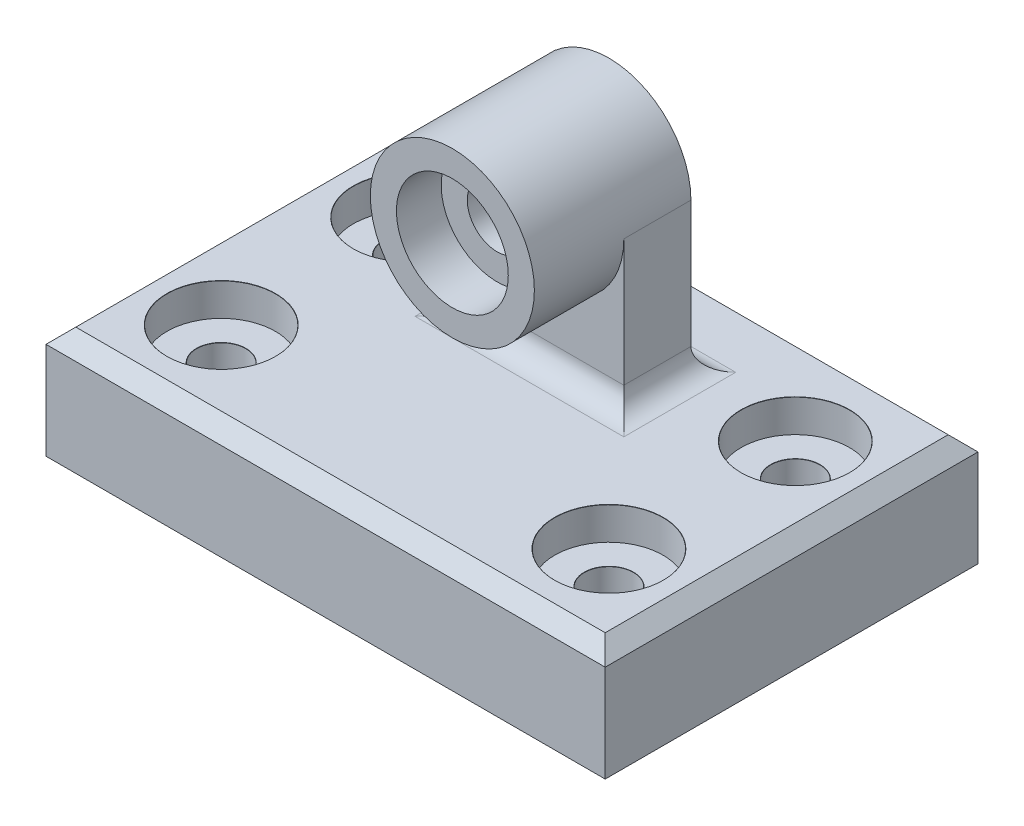
ISO-10303-21;
HEADER;
FILE_DESCRIPTION(('STEP AP214'),'2;1');
FILE_NAME('part.step','',(''),(''),'','','');
FILE_SCHEMA(('AUTOMOTIVE_DESIGN { 1 0 10303 214 1 1 1 1 }'));
ENDSEC;
DATA;
#1=APPLICATION_CONTEXT('core data for automotive mechanical design processes');
#2=APPLICATION_PROTOCOL_DEFINITION('international standard','automotive_design',2000,#1);
#3=PRODUCT_CONTEXT('',#1,'mechanical');
#4=PRODUCT('Part','Part','',(#3));
#5=PRODUCT_RELATED_PRODUCT_CATEGORY('part','',(#4));
#6=PRODUCT_DEFINITION_FORMATION('','',#4);
#7=PRODUCT_DEFINITION_CONTEXT('part definition',#1,'design');
#8=PRODUCT_DEFINITION('design','',#6,#7);
#9=PRODUCT_DEFINITION_SHAPE('','',#8);
#10=(LENGTH_UNIT() NAMED_UNIT(*) SI_UNIT(.MILLI.,.METRE.));
#11=(NAMED_UNIT(*) PLANE_ANGLE_UNIT() SI_UNIT($,.RADIAN.));
#12=(NAMED_UNIT(*) SI_UNIT($,.STERADIAN.) SOLID_ANGLE_UNIT());
#13=UNCERTAINTY_MEASURE_WITH_UNIT(LENGTH_MEASURE(1.E-05),#10,'distance_accuracy_value','');
#14=(GEOMETRIC_REPRESENTATION_CONTEXT(3) GLOBAL_UNCERTAINTY_ASSIGNED_CONTEXT((#13)) GLOBAL_UNIT_ASSIGNED_CONTEXT((#10,
#11,#12)) REPRESENTATION_CONTEXT('',''));
#15=CARTESIAN_POINT('',(0.,0.,0.));
#16=DIRECTION('',(0.,0.,1.));
#17=DIRECTION('',(1.,0.,0.));
#18=AXIS2_PLACEMENT_3D('',#15,#16,#17);
#19=CARTESIAN_POINT('',(37.5,35.,-50.));
#20=DIRECTION('',(0.,0.,1.));
#21=DIRECTION('',(1.,0.,0.));
#22=AXIS2_PLACEMENT_3D('',#19,#20,#21);
#23=CYLINDRICAL_SURFACE('',#22,4.);
#24=CARTESIAN_POINT('',(37.5,35.,-38.));
#25=DIRECTION('',(0.,0.,-1.));
#26=DIRECTION('',(-1.,0.,0.));
#27=AXIS2_PLACEMENT_3D('',#24,#25,#26);
#28=CIRCLE('',#27,4.);
#29=CARTESIAN_POINT('',(33.5,35.,-38.));
#30=VERTEX_POINT('',#29);
#31=EDGE_CURVE('E144',#30,#30,#28,.T.);
#32=ORIENTED_EDGE('',*,*,#31,.T.);
#33=EDGE_LOOP('',(#32));
#34=FACE_BOUND('',#33,.T.);
#35=CARTESIAN_POINT('',(37.5,35.,-23.));
#36=DIRECTION('',(0.,0.,1.));
#37=DIRECTION('',(1.,0.,0.));
#38=AXIS2_PLACEMENT_3D('',#35,#36,#37);
#39=CIRCLE('',#38,4.);
#40=CARTESIAN_POINT('',(41.5,35.,-23.));
#41=VERTEX_POINT('',#40);
#42=EDGE_CURVE('E279',#41,#41,#39,.T.);
#43=ORIENTED_EDGE('',*,*,#42,.T.);
#44=EDGE_LOOP('',(#43));
#45=FACE_BOUND('',#44,.T.);
#46=ADVANCED_FACE('F42',(#34,#45),#23,.F.);
#47=CARTESIAN_POINT('',(0.,15.,-50.));
#48=DIRECTION('',(0.,0.,-1.));
#49=DIRECTION('',(-1.,0.,0.));
#50=AXIS2_PLACEMENT_3D('',#47,#48,#49);
#51=PLANE('',#50);
#52=DIRECTION('',(0.,-1.,0.));
#53=VECTOR('',#52,1.);
#54=CARTESIAN_POINT('',(0.,15.,-50.));
#55=LINE('',#54,#53);
#56=CARTESIAN_POINT('',(0.,13.,-50.));
#57=VERTEX_POINT('',#56);
#58=CARTESIAN_POINT('',(0.,0.,-50.));
#59=VERTEX_POINT('',#58);
#60=EDGE_CURVE('E195',#57,#59,#55,.T.);
#61=ORIENTED_EDGE('',*,*,#60,.F.);
#62=DIRECTION('',(1.,0.,0.));
#63=VECTOR('',#62,1.);
#64=CARTESIAN_POINT('',(0.,13.,-50.));
#65=LINE('',#64,#63);
#66=CARTESIAN_POINT('',(75.,13.,-50.));
#67=VERTEX_POINT('',#66);
#68=EDGE_CURVE('E223',#57,#67,#65,.T.);
#69=ORIENTED_EDGE('',*,*,#68,.T.);
#70=DIRECTION('',(0.,-1.,0.));
#71=VECTOR('',#70,1.);
#72=CARTESIAN_POINT('',(75.,15.,-50.));
#73=LINE('',#72,#71);
#74=CARTESIAN_POINT('',(75.,0.,-50.));
#75=VERTEX_POINT('',#74);
#76=EDGE_CURVE('E194',#67,#75,#73,.T.);
#77=ORIENTED_EDGE('',*,*,#76,.T.);
#78=DIRECTION('',(1.,0.,0.));
#79=VECTOR('',#78,1.);
#80=CARTESIAN_POINT('',(0.,0.,-50.));
#81=LINE('',#80,#79);
#82=EDGE_CURVE('E177',#59,#75,#81,.T.);
#83=ORIENTED_EDGE('',*,*,#82,.F.);
#84=EDGE_LOOP('',(#61,#69,#77,#83));
#85=FACE_BOUND('',#84,.T.);
#86=ADVANCED_FACE('F326',(#85),#51,.T.);
#87=CARTESIAN_POINT('',(0.,15.,0.));
#88=DIRECTION('',(-1.,0.,0.));
#89=DIRECTION('',(0.,0.,1.));
#90=AXIS2_PLACEMENT_3D('',#87,#88,#89);
#91=PLANE('',#90);
#92=DIRECTION('',(0.,-1.,0.));
#93=VECTOR('',#92,1.);
#94=CARTESIAN_POINT('',(0.,15.,0.));
#95=LINE('',#94,#93);
#96=CARTESIAN_POINT('',(0.,13.,0.));
#97=VERTEX_POINT('',#96);
#98=CARTESIAN_POINT('',(0.,0.,0.));
#99=VERTEX_POINT('',#98);
#100=EDGE_CURVE('E199',#97,#99,#95,.T.);
#101=ORIENTED_EDGE('',*,*,#100,.F.);
#102=DIRECTION('',(0.,0.,-1.));
#103=VECTOR('',#102,1.);
#104=CARTESIAN_POINT('',(0.,13.,0.));
#105=LINE('',#104,#103);
#106=EDGE_CURVE('E226',#97,#57,#105,.T.);
#107=ORIENTED_EDGE('',*,*,#106,.T.);
#108=ORIENTED_EDGE('',*,*,#60,.T.);
#109=DIRECTION('',(0.,0.,-1.));
#110=VECTOR('',#109,1.);
#111=CARTESIAN_POINT('',(0.,0.,0.));
#112=LINE('',#111,#110);
#113=EDGE_CURVE('E190',#99,#59,#112,.T.);
#114=ORIENTED_EDGE('',*,*,#113,.F.);
#115=EDGE_LOOP('',(#101,#107,#108,#114));
#116=FACE_BOUND('',#115,.T.);
#117=ADVANCED_FACE('F331',(#116),#91,.T.);
#118=CARTESIAN_POINT('',(0.,15.,0.));
#119=DIRECTION('',(0.,0.,-1.));
#120=DIRECTION('',(-1.,0.,0.));
#121=AXIS2_PLACEMENT_3D('',#118,#119,#120);
#122=PLANE('',#121);
#123=DIRECTION('',(0.,-1.,0.));
#124=VECTOR('',#123,1.);
#125=CARTESIAN_POINT('',(75.,15.,0.));
#126=LINE('',#125,#124);
#127=CARTESIAN_POINT('',(75.,13.,0.));
#128=VERTEX_POINT('',#127);
#129=CARTESIAN_POINT('',(75.,0.,0.));
#130=VERTEX_POINT('',#129);
#131=EDGE_CURVE('E202',#128,#130,#126,.T.);
#132=ORIENTED_EDGE('',*,*,#131,.F.);
#133=DIRECTION('',(-1.,0.,0.));
#134=VECTOR('',#133,1.);
#135=CARTESIAN_POINT('',(0.,13.,0.));
#136=LINE('',#135,#134);
#137=EDGE_CURVE('E229',#128,#97,#136,.T.);
#138=ORIENTED_EDGE('',*,*,#137,.T.);
#139=ORIENTED_EDGE('',*,*,#100,.T.);
#140=DIRECTION('',(1.,0.,0.));
#141=VECTOR('',#140,1.);
#142=CARTESIAN_POINT('',(0.,0.,0.));
#143=LINE('',#142,#141);
#144=EDGE_CURVE('E186',#99,#130,#143,.T.);
#145=ORIENTED_EDGE('',*,*,#144,.T.);
#146=EDGE_LOOP('',(#132,#138,#139,#145));
#147=FACE_BOUND('',#146,.T.);
#148=ADVANCED_FACE('F544',(#147),#122,.F.);
#149=CARTESIAN_POINT('',(75.,15.,0.));
#150=DIRECTION('',(-1.,0.,0.));
#151=DIRECTION('',(0.,0.,1.));
#152=AXIS2_PLACEMENT_3D('',#149,#150,#151);
#153=PLANE('',#152);
#154=ORIENTED_EDGE('',*,*,#76,.F.);
#155=DIRECTION('',(0.,0.,1.));
#156=VECTOR('',#155,1.);
#157=CARTESIAN_POINT('',(75.,13.,0.));
#158=LINE('',#157,#156);
#159=EDGE_CURVE('E219',#67,#128,#158,.T.);
#160=ORIENTED_EDGE('',*,*,#159,.T.);
#161=ORIENTED_EDGE('',*,*,#131,.T.);
#162=DIRECTION('',(0.,0.,-1.));
#163=VECTOR('',#162,1.);
#164=CARTESIAN_POINT('',(75.,0.,0.));
#165=LINE('',#164,#163);
#166=EDGE_CURVE('E181',#130,#75,#165,.T.);
#167=ORIENTED_EDGE('',*,*,#166,.T.);
#168=EDGE_LOOP('',(#154,#160,#161,#167));
#169=FACE_BOUND('',#168,.T.);
#170=ADVANCED_FACE('F541',(#169),#153,.F.);
#171=CARTESIAN_POINT('',(0.,15.,0.));
#172=DIRECTION('',(0.,1.,0.));
#173=DIRECTION('',(0.,0.,1.));
#174=AXIS2_PLACEMENT_3D('',#171,#172,#173);
#175=PLANE('',#174);
#176=CARTESIAN_POINT('',(11.5,15.,-12.));
#177=DIRECTION('',(0.,1.,0.));
#178=DIRECTION('',(0.,0.,1.));
#179=AXIS2_PLACEMENT_3D('',#176,#177,#178);
#180=CIRCLE('',#179,7.3);
#181=CARTESIAN_POINT('',(11.5,15.,-4.7));
#182=VERTEX_POINT('',#181);
#183=EDGE_CURVE('E426',#182,#182,#180,.T.);
#184=ORIENTED_EDGE('',*,*,#183,.F.);
#185=EDGE_LOOP('',(#184));
#186=FACE_BOUND('',#185,.T.);
#187=CARTESIAN_POINT('',(11.5,15.,-37.));
#188=DIRECTION('',(0.,1.,0.));
#189=DIRECTION('',(0.,0.,1.));
#190=AXIS2_PLACEMENT_3D('',#187,#188,#189);
#191=CIRCLE('',#190,7.3);
#192=CARTESIAN_POINT('',(11.5,15.,-29.7));
#193=VERTEX_POINT('',#192);
#194=EDGE_CURVE('E450',#193,#193,#191,.T.);
#195=ORIENTED_EDGE('',*,*,#194,.F.);
#196=EDGE_LOOP('',(#195));
#197=FACE_BOUND('',#196,.T.);
#198=CARTESIAN_POINT('',(63.5,15.,-12.));
#199=DIRECTION('',(0.,1.,0.));
#200=DIRECTION('',(0.,0.,1.));
#201=AXIS2_PLACEMENT_3D('',#198,#199,#200);
#202=CIRCLE('',#201,7.3);
#203=CARTESIAN_POINT('',(63.5,15.,-4.7));
#204=VERTEX_POINT('',#203);
#205=EDGE_CURVE('E474',#204,#204,#202,.T.);
#206=ORIENTED_EDGE('',*,*,#205,.F.);
#207=EDGE_LOOP('',(#206));
#208=FACE_BOUND('',#207,.T.);
#209=CARTESIAN_POINT('',(63.5,15.,-37.));
#210=DIRECTION('',(0.,1.,0.));
#211=DIRECTION('',(0.,0.,1.));
#212=AXIS2_PLACEMENT_3D('',#209,#210,#211);
#213=CIRCLE('',#212,7.3);
#214=CARTESIAN_POINT('',(63.5,15.,-29.7));
#215=VERTEX_POINT('',#214);
#216=EDGE_CURVE('E498',#215,#215,#213,.T.);
#217=ORIENTED_EDGE('',*,*,#216,.F.);
#218=EDGE_LOOP('',(#217));
#219=FACE_BOUND('',#218,.T.);
#220=DIRECTION('',(-1.,0.,0.));
#221=VECTOR('',#220,1.);
#222=CARTESIAN_POINT('',(26.5,15.,-26.));
#223=LINE('',#222,#221);
#224=CARTESIAN_POINT('',(51.5,15.,-26.));
#225=VERTEX_POINT('',#224);
#226=CARTESIAN_POINT('',(23.5,15.,-26.));
#227=VERTEX_POINT('',#226);
#228=EDGE_CURVE('E232',#225,#227,#223,.T.);
#229=ORIENTED_EDGE('',*,*,#228,.T.);
#230=DIRECTION('',(0.,0.,-1.));
#231=VECTOR('',#230,1.);
#232=CARTESIAN_POINT('',(23.5,15.,-38.));
#233=LINE('',#232,#231);
#234=CARTESIAN_POINT('',(23.5,15.,-41.));
#235=VERTEX_POINT('',#234);
#236=EDGE_CURVE('E253',#227,#235,#233,.T.);
#237=ORIENTED_EDGE('',*,*,#236,.T.);
#238=DIRECTION('',(1.,0.,0.));
#239=VECTOR('',#238,1.);
#240=CARTESIAN_POINT('',(48.5,15.,-41.));
#241=LINE('',#240,#239);
#242=CARTESIAN_POINT('',(51.5,15.,-41.));
#243=VERTEX_POINT('',#242);
#244=EDGE_CURVE('E250',#235,#243,#241,.T.);
#245=ORIENTED_EDGE('',*,*,#244,.T.);
#246=DIRECTION('',(0.,0.,1.));
#247=VECTOR('',#246,1.);
#248=CARTESIAN_POINT('',(51.5,15.,-29.));
#249=LINE('',#248,#247);
#250=EDGE_CURVE('E247',#243,#225,#249,.T.);
#251=ORIENTED_EDGE('',*,*,#250,.T.);
#252=EDGE_LOOP('',(#229,#237,#245,#251));
#253=FACE_BOUND('',#252,.T.);
#254=DIRECTION('',(1.,0.,0.));
#255=VECTOR('',#254,1.);
#256=CARTESIAN_POINT('',(75.,15.,-2.));
#257=LINE('',#256,#255);
#258=CARTESIAN_POINT('',(2.,15.,-2.));
#259=VERTEX_POINT('',#258);
#260=CARTESIAN_POINT('',(73.,15.,-2.));
#261=VERTEX_POINT('',#260);
#262=EDGE_CURVE('E198',#259,#261,#257,.T.);
#263=ORIENTED_EDGE('',*,*,#262,.T.);
#264=DIRECTION('',(0.,0.,-1.));
#265=VECTOR('',#264,1.);
#266=CARTESIAN_POINT('',(73.,15.,-50.));
#267=LINE('',#266,#265);
#268=CARTESIAN_POINT('',(73.,15.,-48.));
#269=VERTEX_POINT('',#268);
#270=EDGE_CURVE('E215',#261,#269,#267,.T.);
#271=ORIENTED_EDGE('',*,*,#270,.T.);
#272=DIRECTION('',(-1.,0.,0.));
#273=VECTOR('',#272,1.);
#274=CARTESIAN_POINT('',(0.,15.,-48.));
#275=LINE('',#274,#273);
#276=CARTESIAN_POINT('',(2.,15.,-48.));
#277=VERTEX_POINT('',#276);
#278=EDGE_CURVE('E212',#269,#277,#275,.T.);
#279=ORIENTED_EDGE('',*,*,#278,.T.);
#280=DIRECTION('',(0.,0.,1.));
#281=VECTOR('',#280,1.);
#282=CARTESIAN_POINT('',(2.,15.,0.));
#283=LINE('',#282,#281);
#284=EDGE_CURVE('E209',#277,#259,#283,.T.);
#285=ORIENTED_EDGE('',*,*,#284,.T.);
#286=EDGE_LOOP('',(#263,#271,#279,#285));
#287=FACE_BOUND('',#286,.T.);
#288=ADVANCED_FACE('F528',(#186,#197,#208,#219,#253,#287),#175,.T.);
#289=CARTESIAN_POINT('',(0.,0.,0.));
#290=DIRECTION('',(0.,1.,0.));
#291=DIRECTION('',(0.,0.,1.));
#292=AXIS2_PLACEMENT_3D('',#289,#290,#291);
#293=PLANE('',#292);
#294=CARTESIAN_POINT('',(11.5,0.,-12.));
#295=DIRECTION('',(0.,1.,0.));
#296=DIRECTION('',(0.,0.,1.));
#297=AXIS2_PLACEMENT_3D('',#294,#295,#296);
#298=CIRCLE('',#297,3.3);
#299=CARTESIAN_POINT('',(11.5,0.,-8.70000000000001));
#300=VERTEX_POINT('',#299);
#301=EDGE_CURVE('E446',#300,#300,#298,.T.);
#302=ORIENTED_EDGE('',*,*,#301,.T.);
#303=EDGE_LOOP('',(#302));
#304=FACE_BOUND('',#303,.T.);
#305=CARTESIAN_POINT('',(11.5,0.,-37.));
#306=DIRECTION('',(0.,1.,0.));
#307=DIRECTION('',(0.,0.,1.));
#308=AXIS2_PLACEMENT_3D('',#305,#306,#307);
#309=CIRCLE('',#308,3.3);
#310=CARTESIAN_POINT('',(11.5,0.,-33.7));
#311=VERTEX_POINT('',#310);
#312=EDGE_CURVE('E470',#311,#311,#309,.T.);
#313=ORIENTED_EDGE('',*,*,#312,.T.);
#314=EDGE_LOOP('',(#313));
#315=FACE_BOUND('',#314,.T.);
#316=CARTESIAN_POINT('',(63.5,0.,-12.));
#317=DIRECTION('',(0.,1.,0.));
#318=DIRECTION('',(0.,0.,1.));
#319=AXIS2_PLACEMENT_3D('',#316,#317,#318);
#320=CIRCLE('',#319,3.3);
#321=CARTESIAN_POINT('',(63.5,0.,-8.70000000000001));
#322=VERTEX_POINT('',#321);
#323=EDGE_CURVE('E494',#322,#322,#320,.T.);
#324=ORIENTED_EDGE('',*,*,#323,.T.);
#325=EDGE_LOOP('',(#324));
#326=FACE_BOUND('',#325,.T.);
#327=CARTESIAN_POINT('',(63.5,0.,-37.));
#328=DIRECTION('',(0.,1.,0.));
#329=DIRECTION('',(0.,0.,1.));
#330=AXIS2_PLACEMENT_3D('',#327,#328,#329);
#331=CIRCLE('',#330,3.3);
#332=CARTESIAN_POINT('',(63.5,0.,-33.7));
#333=VERTEX_POINT('',#332);
#334=EDGE_CURVE('E268',#333,#333,#331,.T.);
#335=ORIENTED_EDGE('',*,*,#334,.T.);
#336=EDGE_LOOP('',(#335));
#337=FACE_BOUND('',#336,.T.);
#338=ORIENTED_EDGE('',*,*,#82,.T.);
#339=ORIENTED_EDGE('',*,*,#166,.F.);
#340=ORIENTED_EDGE('',*,*,#144,.F.);
#341=ORIENTED_EDGE('',*,*,#113,.T.);
#342=EDGE_LOOP('',(#338,#339,#340,#341));
#343=FACE_BOUND('',#342,.T.);
#344=ADVANCED_FACE('F524',(#304,#315,#326,#337,#343),#293,.F.);
#345=CARTESIAN_POINT('',(0.,13.,0.));
#346=DIRECTION('',(0.70710678118655,-0.707106781186545,0.));
#347=DIRECTION('',(0.,0.,-1.));
#348=AXIS2_PLACEMENT_3D('',#345,#346,#347);
#349=PLANE('',#348);
#350=DIRECTION('',(-0.577350269189624,-0.577350269189628,-0.577350269189624));
#351=VECTOR('',#350,1.);
#352=CARTESIAN_POINT('',(16.6666666666666,29.6666666666667,-33.3333333333334));
#353=LINE('',#352,#351);
#354=EDGE_CURVE('E238',#57,#277,#353,.F.);
#355=ORIENTED_EDGE('',*,*,#354,.F.);
#356=ORIENTED_EDGE('',*,*,#106,.F.);
#357=DIRECTION('',(0.577350269189624,0.577350269189628,-0.577350269189624));
#358=VECTOR('',#357,1.);
#359=CARTESIAN_POINT('',(1.33333333333334,14.3333333333333,-1.33333333333334));
#360=LINE('',#359,#358);
#361=EDGE_CURVE('E182',#259,#97,#360,.F.);
#362=ORIENTED_EDGE('',*,*,#361,.F.);
#363=ORIENTED_EDGE('',*,*,#284,.F.);
#364=EDGE_LOOP('',(#355,#356,#362,#363));
#365=FACE_BOUND('',#364,.T.);
#366=ADVANCED_FACE('F527',(#365),#349,.F.);
#367=CARTESIAN_POINT('',(0.,15.,-2.));
#368=DIRECTION('',(0.,0.707106781186545,0.70710678118655));
#369=DIRECTION('',(-1.,0.,0.));
#370=AXIS2_PLACEMENT_3D('',#367,#368,#369);
#371=PLANE('',#370);
#372=ORIENTED_EDGE('',*,*,#361,.T.);
#373=ORIENTED_EDGE('',*,*,#137,.F.);
#374=DIRECTION('',(-0.577350269189624,0.577350269189628,-0.577350269189624));
#375=VECTOR('',#374,1.);
#376=CARTESIAN_POINT('',(48.6666666666668,39.3333333333334,-26.3333333333332));
#377=LINE('',#376,#375);
#378=EDGE_CURVE('E235',#261,#128,#377,.F.);
#379=ORIENTED_EDGE('',*,*,#378,.F.);
#380=ORIENTED_EDGE('',*,*,#262,.F.);
#381=EDGE_LOOP('',(#372,#373,#379,#380));
#382=FACE_BOUND('',#381,.T.);
#383=ADVANCED_FACE('F554',(#382),#371,.T.);
#384=CARTESIAN_POINT('',(0.,13.,-50.));
#385=DIRECTION('',(0.,-0.707106781186545,0.70710678118655));
#386=DIRECTION('',(1.,0.,0.));
#387=AXIS2_PLACEMENT_3D('',#384,#385,#386);
#388=PLANE('',#387);
#389=ORIENTED_EDGE('',*,*,#354,.T.);
#390=ORIENTED_EDGE('',*,*,#278,.F.);
#391=DIRECTION('',(-0.577350269189624,0.577350269189628,0.577350269189624));
#392=VECTOR('',#391,1.);
#393=CARTESIAN_POINT('',(50.0000000000001,38.,-25.0000000000001));
#394=LINE('',#393,#392);
#395=EDGE_CURVE('E172',#67,#269,#394,.T.);
#396=ORIENTED_EDGE('',*,*,#395,.F.);
#397=ORIENTED_EDGE('',*,*,#68,.F.);
#398=EDGE_LOOP('',(#389,#390,#396,#397));
#399=FACE_BOUND('',#398,.T.);
#400=ADVANCED_FACE('F560',(#399),#388,.F.);
#401=CARTESIAN_POINT('',(73.,15.,0.));
#402=DIRECTION('',(0.70710678118655,0.707106781186545,0.));
#403=DIRECTION('',(0.,0.,1.));
#404=AXIS2_PLACEMENT_3D('',#401,#402,#403);
#405=PLANE('',#404);
#406=ORIENTED_EDGE('',*,*,#378,.T.);
#407=ORIENTED_EDGE('',*,*,#159,.F.);
#408=ORIENTED_EDGE('',*,*,#395,.T.);
#409=ORIENTED_EDGE('',*,*,#270,.F.);
#410=EDGE_LOOP('',(#406,#407,#408,#409));
#411=FACE_BOUND('',#410,.T.);
#412=ADVANCED_FACE('F563',(#411),#405,.T.);
#413=CARTESIAN_POINT('',(48.5,35.,-29.));
#414=DIRECTION('',(0.,0.,1.));
#415=DIRECTION('',(1.,0.,0.));
#416=AXIS2_PLACEMENT_3D('',#413,#414,#415);
#417=PLANE('',#416);
#418=DIRECTION('',(0.,-1.,0.));
#419=VECTOR('',#418,1.);
#420=CARTESIAN_POINT('',(26.5,35.,-29.));
#421=LINE('',#420,#419);
#422=CARTESIAN_POINT('',(26.5,35.,-29.));
#423=VERTEX_POINT('',#422);
#424=CARTESIAN_POINT('',(26.5,18.,-29.));
#425=VERTEX_POINT('',#424);
#426=EDGE_CURVE('E156',#423,#425,#421,.T.);
#427=ORIENTED_EDGE('',*,*,#426,.T.);
#428=DIRECTION('',(-1.,0.,0.));
#429=VECTOR('',#428,1.);
#430=CARTESIAN_POINT('',(48.5,18.,-29.));
#431=LINE('',#430,#429);
#432=CARTESIAN_POINT('',(48.5,18.,-29.));
#433=VERTEX_POINT('',#432);
#434=EDGE_CURVE('E11',#425,#433,#431,.F.);
#435=ORIENTED_EDGE('',*,*,#434,.T.);
#436=DIRECTION('',(0.,-1.,0.));
#437=VECTOR('',#436,1.);
#438=CARTESIAN_POINT('',(48.5,35.,-29.));
#439=LINE('',#438,#437);
#440=CARTESIAN_POINT('',(48.5,35.,-29.));
#441=VERTEX_POINT('',#440);
#442=EDGE_CURVE('E169',#441,#433,#439,.T.);
#443=ORIENTED_EDGE('',*,*,#442,.F.);
#444=CARTESIAN_POINT('',(37.5,35.,-29.));
#445=DIRECTION('',(0.,0.,1.));
#446=DIRECTION('',(1.,0.,0.));
#447=AXIS2_PLACEMENT_3D('',#444,#445,#446);
#448=CIRCLE('',#447,11.);
#449=EDGE_CURVE('E161',#423,#441,#448,.T.);
#450=ORIENTED_EDGE('',*,*,#449,.F.);
#451=EDGE_LOOP('',(#427,#435,#443,#450));
#452=FACE_BOUND('',#451,.T.);
#453=ADVANCED_FACE('F565',(#452),#417,.T.);
#454=CARTESIAN_POINT('',(48.5,35.,-38.));
#455=DIRECTION('',(1.,0.,0.));
#456=DIRECTION('',(0.,0.,-1.));
#457=AXIS2_PLACEMENT_3D('',#454,#455,#456);
#458=PLANE('',#457);
#459=ORIENTED_EDGE('',*,*,#442,.T.);
#460=DIRECTION('',(0.,0.,1.));
#461=VECTOR('',#460,1.);
#462=CARTESIAN_POINT('',(48.5,18.,-38.));
#463=LINE('',#462,#461);
#464=CARTESIAN_POINT('',(48.5,18.,-38.));
#465=VERTEX_POINT('',#464);
#466=EDGE_CURVE('E52',#433,#465,#463,.F.);
#467=ORIENTED_EDGE('',*,*,#466,.T.);
#468=DIRECTION('',(0.,-1.,0.));
#469=VECTOR('',#468,1.);
#470=CARTESIAN_POINT('',(48.5,35.,-38.));
#471=LINE('',#470,#469);
#472=CARTESIAN_POINT('',(48.5,35.,-38.));
#473=VERTEX_POINT('',#472);
#474=EDGE_CURVE('E155',#473,#465,#471,.T.);
#475=ORIENTED_EDGE('',*,*,#474,.F.);
#476=DIRECTION('',(0.,0.,1.));
#477=VECTOR('',#476,1.);
#478=CARTESIAN_POINT('',(48.5,35.,-38.));
#479=LINE('',#478,#477);
#480=EDGE_CURVE('E140',#473,#441,#479,.T.);
#481=ORIENTED_EDGE('',*,*,#480,.T.);
#482=EDGE_LOOP('',(#459,#467,#475,#481));
#483=FACE_BOUND('',#482,.T.);
#484=ADVANCED_FACE('F571',(#483),#458,.T.);
#485=CARTESIAN_POINT('',(26.5,35.,-38.));
#486=DIRECTION('',(0.,0.,-1.));
#487=DIRECTION('',(-1.,0.,0.));
#488=AXIS2_PLACEMENT_3D('',#485,#486,#487);
#489=PLANE('',#488);
#490=ORIENTED_EDGE('',*,*,#31,.F.);
#491=EDGE_LOOP('',(#490));
#492=FACE_BOUND('',#491,.T.);
#493=ORIENTED_EDGE('',*,*,#474,.T.);
#494=DIRECTION('',(1.,0.,0.));
#495=VECTOR('',#494,1.);
#496=CARTESIAN_POINT('',(26.5,18.,-38.));
#497=LINE('',#496,#495);
#498=CARTESIAN_POINT('',(26.5,18.,-38.));
#499=VERTEX_POINT('',#498);
#500=EDGE_CURVE('E150',#465,#499,#497,.F.);
#501=ORIENTED_EDGE('',*,*,#500,.T.);
#502=DIRECTION('',(0.,-1.,0.));
#503=VECTOR('',#502,1.);
#504=CARTESIAN_POINT('',(26.5,35.,-38.));
#505=LINE('',#504,#503);
#506=CARTESIAN_POINT('',(26.5,35.,-38.));
#507=VERTEX_POINT('',#506);
#508=EDGE_CURVE('E147',#507,#499,#505,.T.);
#509=ORIENTED_EDGE('',*,*,#508,.F.);
#510=CARTESIAN_POINT('',(37.5,35.,-38.));
#511=DIRECTION('',(0.,0.,-1.));
#512=DIRECTION('',(-1.,0.,0.));
#513=AXIS2_PLACEMENT_3D('',#510,#511,#512);
#514=CIRCLE('',#513,11.);
#515=EDGE_CURVE('E133',#507,#473,#514,.T.);
#516=ORIENTED_EDGE('',*,*,#515,.T.);
#517=EDGE_LOOP('',(#493,#501,#509,#516));
#518=FACE_BOUND('',#517,.T.);
#519=ADVANCED_FACE('F148',(#492,#518),#489,.T.);
#520=CARTESIAN_POINT('',(26.5,35.,-29.));
#521=DIRECTION('',(-1.,0.,0.));
#522=DIRECTION('',(0.,0.,1.));
#523=AXIS2_PLACEMENT_3D('',#520,#521,#522);
#524=PLANE('',#523);
#525=ORIENTED_EDGE('',*,*,#508,.T.);
#526=DIRECTION('',(0.,0.,-1.));
#527=VECTOR('',#526,1.);
#528=CARTESIAN_POINT('',(26.5,18.,-29.));
#529=LINE('',#528,#527);
#530=EDGE_CURVE('E257',#499,#425,#529,.F.);
#531=ORIENTED_EDGE('',*,*,#530,.T.);
#532=ORIENTED_EDGE('',*,*,#426,.F.);
#533=DIRECTION('',(0.,0.,-1.));
#534=VECTOR('',#533,1.);
#535=CARTESIAN_POINT('',(26.5,35.,-29.));
#536=LINE('',#535,#534);
#537=EDGE_CURVE('E137',#423,#507,#536,.T.);
#538=ORIENTED_EDGE('',*,*,#537,.T.);
#539=EDGE_LOOP('',(#525,#531,#532,#538));
#540=FACE_BOUND('',#539,.T.);
#541=ADVANCED_FACE('F159',(#540),#524,.T.);
#542=CARTESIAN_POINT('',(37.5,35.,-17.));
#543=DIRECTION('',(0.,0.,-1.));
#544=DIRECTION('',(-1.,0.,0.));
#545=AXIS2_PLACEMENT_3D('',#542,#543,#544);
#546=CYLINDRICAL_SURFACE('',#545,11.);
#547=CARTESIAN_POINT('',(37.5,35.,-17.));
#548=DIRECTION('',(0.,0.,-1.));
#549=DIRECTION('',(-1.,0.,0.));
#550=AXIS2_PLACEMENT_3D('',#547,#548,#549);
#551=CIRCLE('',#550,11.);
#552=CARTESIAN_POINT('',(26.5,35.,-17.));
#553=VERTEX_POINT('',#552);
#554=EDGE_CURVE('E143',#553,#553,#551,.T.);
#555=ORIENTED_EDGE('',*,*,#554,.T.);
#556=EDGE_LOOP('',(#555));
#557=FACE_BOUND('',#556,.T.);
#558=ORIENTED_EDGE('',*,*,#537,.F.);
#559=ORIENTED_EDGE('',*,*,#449,.T.);
#560=ORIENTED_EDGE('',*,*,#480,.F.);
#561=ORIENTED_EDGE('',*,*,#515,.F.);
#562=EDGE_LOOP('',(#558,#559,#560,#561));
#563=FACE_BOUND('',#562,.T.);
#564=ADVANCED_FACE('F135',(#557,#563),#546,.T.);
#565=CARTESIAN_POINT('',(37.5,35.,-17.));
#566=DIRECTION('',(0.,0.,-1.));
#567=DIRECTION('',(-1.,0.,0.));
#568=AXIS2_PLACEMENT_3D('',#565,#566,#567);
#569=PLANE('',#568);
#570=CARTESIAN_POINT('',(37.5,35.,-17.));
#571=DIRECTION('',(0.,0.,1.));
#572=DIRECTION('',(1.,0.,0.));
#573=AXIS2_PLACEMENT_3D('',#570,#571,#572);
#574=CIRCLE('',#573,7.5);
#575=CARTESIAN_POINT('',(45.,35.,-17.));
#576=VERTEX_POINT('',#575);
#577=EDGE_CURVE('E286',#576,#576,#574,.T.);
#578=ORIENTED_EDGE('',*,*,#577,.F.);
#579=EDGE_LOOP('',(#578));
#580=FACE_BOUND('',#579,.T.);
#581=ORIENTED_EDGE('',*,*,#554,.F.);
#582=EDGE_LOOP('',(#581));
#583=FACE_BOUND('',#582,.T.);
#584=ADVANCED_FACE('F310',(#580,#583),#569,.F.);
#585=CARTESIAN_POINT('',(37.5,35.,-23.));
#586=DIRECTION('',(0.,0.,1.));
#587=DIRECTION('',(1.,0.,0.));
#588=AXIS2_PLACEMENT_3D('',#585,#586,#587);
#589=CYLINDRICAL_SURFACE('',#588,7.5);
#590=CARTESIAN_POINT('',(37.5,35.,-23.));
#591=DIRECTION('',(0.,0.,1.));
#592=DIRECTION('',(1.,0.,0.));
#593=AXIS2_PLACEMENT_3D('',#590,#591,#592);
#594=CIRCLE('',#593,7.5);
#595=CARTESIAN_POINT('',(45.,35.,-23.));
#596=VERTEX_POINT('',#595);
#597=EDGE_CURVE('E293',#596,#596,#594,.T.);
#598=ORIENTED_EDGE('',*,*,#597,.F.);
#599=EDGE_LOOP('',(#598));
#600=FACE_BOUND('',#599,.T.);
#601=ORIENTED_EDGE('',*,*,#577,.T.);
#602=EDGE_LOOP('',(#601));
#603=FACE_BOUND('',#602,.T.);
#604=ADVANCED_FACE('F312',(#600,#603),#589,.F.);
#605=CARTESIAN_POINT('',(37.5,35.,-23.));
#606=DIRECTION('',(0.,0.,1.));
#607=DIRECTION('',(1.,0.,0.));
#608=AXIS2_PLACEMENT_3D('',#605,#606,#607);
#609=PLANE('',#608);
#610=ORIENTED_EDGE('',*,*,#42,.F.);
#611=EDGE_LOOP('',(#610));
#612=FACE_BOUND('',#611,.T.);
#613=ORIENTED_EDGE('',*,*,#597,.T.);
#614=EDGE_LOOP('',(#613));
#615=FACE_BOUND('',#614,.T.);
#616=ADVANCED_FACE('F319',(#612,#615),#609,.T.);
#617=CARTESIAN_POINT('',(51.5,18.,0.));
#618=DIRECTION('',(0.,0.,-1.));
#619=DIRECTION('',(-1.,0.,0.));
#620=AXIS2_PLACEMENT_3D('',#617,#618,#619);
#621=CYLINDRICAL_SURFACE('',#620,3.);
#622=CARTESIAN_POINT('',(51.5,18.,-41.));
#623=DIRECTION('',(-0.707106781186548,0.,-0.707106781186547));
#624=DIRECTION('',(0.707106781186547,0.,-0.707106781186548));
#625=AXIS2_PLACEMENT_3D('',#622,#623,#624);
#626=ELLIPSE('',#625,4.24264068711929,3.);
#627=EDGE_CURVE('E270',#465,#243,#626,.F.);
#628=ORIENTED_EDGE('',*,*,#627,.F.);
#629=ORIENTED_EDGE('',*,*,#466,.F.);
#630=CARTESIAN_POINT('',(51.5,18.,-26.));
#631=DIRECTION('',(0.707106781186547,0.,-0.707106781186548));
#632=DIRECTION('',(0.707106781186548,0.,0.707106781186547));
#633=AXIS2_PLACEMENT_3D('',#630,#631,#632);
#634=ELLIPSE('',#633,4.24264068711928,3.);
#635=EDGE_CURVE('E46',#225,#433,#634,.T.);
#636=ORIENTED_EDGE('',*,*,#635,.F.);
#637=ORIENTED_EDGE('',*,*,#250,.F.);
#638=EDGE_LOOP('',(#628,#629,#636,#637));
#639=FACE_BOUND('',#638,.T.);
#640=ADVANCED_FACE('F44',(#639),#621,.F.);
#641=CARTESIAN_POINT('',(0.,18.,-26.));
#642=DIRECTION('',(1.,0.,0.));
#643=DIRECTION('',(0.,0.,-1.));
#644=AXIS2_PLACEMENT_3D('',#641,#642,#643);
#645=CYLINDRICAL_SURFACE('',#644,3.);
#646=ORIENTED_EDGE('',*,*,#635,.T.);
#647=ORIENTED_EDGE('',*,*,#434,.F.);
#648=CARTESIAN_POINT('',(23.5,18.,-26.));
#649=DIRECTION('',(0.707106781186548,0.,0.707106781186547));
#650=DIRECTION('',(0.707106781186547,0.,-0.707106781186548));
#651=AXIS2_PLACEMENT_3D('',#648,#649,#650);
#652=ELLIPSE('',#651,4.24264068711929,3.);
#653=EDGE_CURVE('E267',#227,#425,#652,.T.);
#654=ORIENTED_EDGE('',*,*,#653,.F.);
#655=ORIENTED_EDGE('',*,*,#228,.F.);
#656=EDGE_LOOP('',(#646,#647,#654,#655));
#657=FACE_BOUND('',#656,.T.);
#658=ADVANCED_FACE('F597',(#657),#645,.F.);
#659=CARTESIAN_POINT('',(0.,18.,-41.));
#660=DIRECTION('',(-1.,0.,0.));
#661=DIRECTION('',(0.,0.,1.));
#662=AXIS2_PLACEMENT_3D('',#659,#660,#661);
#663=CYLINDRICAL_SURFACE('',#662,3.);
#664=ORIENTED_EDGE('',*,*,#627,.T.);
#665=ORIENTED_EDGE('',*,*,#244,.F.);
#666=CARTESIAN_POINT('',(23.5,18.,-41.));
#667=DIRECTION('',(-0.707106781186547,0.,0.707106781186548));
#668=DIRECTION('',(-0.707106781186548,0.,-0.707106781186547));
#669=AXIS2_PLACEMENT_3D('',#666,#667,#668);
#670=ELLIPSE('',#669,4.24264068711928,3.);
#671=EDGE_CURVE('E264',#499,#235,#670,.F.);
#672=ORIENTED_EDGE('',*,*,#671,.F.);
#673=ORIENTED_EDGE('',*,*,#500,.F.);
#674=EDGE_LOOP('',(#664,#665,#672,#673));
#675=FACE_BOUND('',#674,.T.);
#676=ADVANCED_FACE('F594',(#675),#663,.F.);
#677=CARTESIAN_POINT('',(23.5,18.,0.));
#678=DIRECTION('',(0.,0.,1.));
#679=DIRECTION('',(1.,0.,0.));
#680=AXIS2_PLACEMENT_3D('',#677,#678,#679);
#681=CYLINDRICAL_SURFACE('',#680,3.);
#682=ORIENTED_EDGE('',*,*,#653,.T.);
#683=ORIENTED_EDGE('',*,*,#530,.F.);
#684=ORIENTED_EDGE('',*,*,#671,.T.);
#685=ORIENTED_EDGE('',*,*,#236,.F.);
#686=EDGE_LOOP('',(#682,#683,#684,#685));
#687=FACE_BOUND('',#686,.T.);
#688=ADVANCED_FACE('F342',(#687),#681,.F.);
#689=CARTESIAN_POINT('',(63.5,15.,-37.));
#690=DIRECTION('',(0.,1.,0.));
#691=DIRECTION('',(0.,0.,1.));
#692=AXIS2_PLACEMENT_3D('',#689,#690,#691);
#693=CYLINDRICAL_SURFACE('',#692,3.3);
#694=ORIENTED_EDGE('',*,*,#334,.F.);
#695=EDGE_LOOP('',(#694));
#696=FACE_BOUND('',#695,.T.);
#697=CARTESIAN_POINT('',(63.5,10.595,-37.));
#698=DIRECTION('',(0.,1.,0.));
#699=DIRECTION('',(0.,0.,1.));
#700=AXIS2_PLACEMENT_3D('',#697,#698,#699);
#701=CIRCLE('',#700,3.30000000000001);
#702=CARTESIAN_POINT('',(63.5,10.595,-33.7));
#703=VERTEX_POINT('',#702);
#704=EDGE_CURVE('E513',#703,#703,#701,.T.);
#705=ORIENTED_EDGE('',*,*,#704,.T.);
#706=EDGE_LOOP('',(#705));
#707=FACE_BOUND('',#706,.T.);
#708=ADVANCED_FACE('F338',(#696,#707),#693,.F.);
#709=CARTESIAN_POINT('',(63.5,10.62,-37.));
#710=DIRECTION('',(0.,1.,0.));
#711=DIRECTION('',(0.,0.,1.));
#712=AXIS2_PLACEMENT_3D('',#709,#710,#711);
#713=CONICAL_SURFACE('',#712,3.32499999999999,0.785398163397032);
#714=ORIENTED_EDGE('',*,*,#704,.F.);
#715=EDGE_LOOP('',(#714));
#716=FACE_BOUND('',#715,.T.);
#717=CARTESIAN_POINT('',(63.5,10.62,-37.));
#718=DIRECTION('',(0.,1.,0.));
#719=DIRECTION('',(0.,0.,1.));
#720=AXIS2_PLACEMENT_3D('',#717,#718,#719);
#721=CIRCLE('',#720,3.32499999999999);
#722=CARTESIAN_POINT('',(63.5,10.62,-33.675));
#723=VERTEX_POINT('',#722);
#724=EDGE_CURVE('E510',#723,#723,#721,.T.);
#725=ORIENTED_EDGE('',*,*,#724,.T.);
#726=EDGE_LOOP('',(#725));
#727=FACE_BOUND('',#726,.T.);
#728=ADVANCED_FACE('F341',(#716,#727),#713,.F.);
#729=CARTESIAN_POINT('',(66.825,10.62,-37.));
#730=DIRECTION('',(0.,-1.,0.));
#731=DIRECTION('',(0.,0.,-1.));
#732=AXIS2_PLACEMENT_3D('',#729,#730,#731);
#733=PLANE('',#732);
#734=ORIENTED_EDGE('',*,*,#724,.F.);
#735=EDGE_LOOP('',(#734));
#736=FACE_BOUND('',#735,.T.);
#737=CARTESIAN_POINT('',(63.5,10.62,-37.));
#738=DIRECTION('',(0.,1.,0.));
#739=DIRECTION('',(0.,0.,1.));
#740=AXIS2_PLACEMENT_3D('',#737,#738,#739);
#741=CIRCLE('',#740,7.27499999999999);
#742=CARTESIAN_POINT('',(63.5,10.62,-29.725));
#743=VERTEX_POINT('',#742);
#744=EDGE_CURVE('E506',#743,#743,#741,.T.);
#745=ORIENTED_EDGE('',*,*,#744,.T.);
#746=EDGE_LOOP('',(#745));
#747=FACE_BOUND('',#746,.T.);
#748=ADVANCED_FACE('F346',(#736,#747),#733,.F.);
#749=CARTESIAN_POINT('',(63.5,15.,-37.));
#750=DIRECTION('',(0.,1.,0.));
#751=DIRECTION('',(0.,0.,1.));
#752=AXIS2_PLACEMENT_3D('',#749,#750,#751);
#753=CYLINDRICAL_SURFACE('',#752,7.27499999999999);
#754=ORIENTED_EDGE('',*,*,#744,.F.);
#755=EDGE_LOOP('',(#754));
#756=FACE_BOUND('',#755,.T.);
#757=CARTESIAN_POINT('',(63.5,14.975,-37.));
#758=DIRECTION('',(0.,1.,0.));
#759=DIRECTION('',(0.,0.,1.));
#760=AXIS2_PLACEMENT_3D('',#757,#758,#759);
#761=CIRCLE('',#760,7.27499999999999);
#762=CARTESIAN_POINT('',(63.5,14.975,-29.725));
#763=VERTEX_POINT('',#762);
#764=EDGE_CURVE('E502',#763,#763,#761,.T.);
#765=ORIENTED_EDGE('',*,*,#764,.T.);
#766=EDGE_LOOP('',(#765));
#767=FACE_BOUND('',#766,.T.);
#768=ADVANCED_FACE('F350',(#756,#767),#753,.F.);
#769=CARTESIAN_POINT('',(63.5,15.,-37.));
#770=DIRECTION('',(0.,1.,0.));
#771=DIRECTION('',(0.,0.,1.));
#772=AXIS2_PLACEMENT_3D('',#769,#770,#771);
#773=CONICAL_SURFACE('',#772,7.3,0.785398163397448);
#774=ORIENTED_EDGE('',*,*,#764,.F.);
#775=EDGE_LOOP('',(#774));
#776=FACE_BOUND('',#775,.T.);
#777=ORIENTED_EDGE('',*,*,#216,.T.);
#778=EDGE_LOOP('',(#777));
#779=FACE_BOUND('',#778,.T.);
#780=ADVANCED_FACE('F354',(#776,#779),#773,.F.);
#781=CARTESIAN_POINT('',(63.5,15.,-12.));
#782=DIRECTION('',(0.,1.,0.));
#783=DIRECTION('',(0.,0.,1.));
#784=AXIS2_PLACEMENT_3D('',#781,#782,#783);
#785=CYLINDRICAL_SURFACE('',#784,3.3);
#786=ORIENTED_EDGE('',*,*,#323,.F.);
#787=EDGE_LOOP('',(#786));
#788=FACE_BOUND('',#787,.T.);
#789=CARTESIAN_POINT('',(63.5,10.595,-12.));
#790=DIRECTION('',(0.,1.,0.));
#791=DIRECTION('',(0.,0.,1.));
#792=AXIS2_PLACEMENT_3D('',#789,#790,#791);
#793=CIRCLE('',#792,3.30000000000001);
#794=CARTESIAN_POINT('',(63.5,10.595,-8.69999999999999));
#795=VERTEX_POINT('',#794);
#796=EDGE_CURVE('E490',#795,#795,#793,.T.);
#797=ORIENTED_EDGE('',*,*,#796,.T.);
#798=EDGE_LOOP('',(#797));
#799=FACE_BOUND('',#798,.T.);
#800=ADVANCED_FACE('F358',(#788,#799),#785,.F.);
#801=CARTESIAN_POINT('',(63.5,10.62,-12.));
#802=DIRECTION('',(0.,1.,0.));
#803=DIRECTION('',(0.,0.,1.));
#804=AXIS2_PLACEMENT_3D('',#801,#802,#803);
#805=CONICAL_SURFACE('',#804,3.32499999999999,0.785398163397032);
#806=ORIENTED_EDGE('',*,*,#796,.F.);
#807=EDGE_LOOP('',(#806));
#808=FACE_BOUND('',#807,.T.);
#809=CARTESIAN_POINT('',(63.5,10.62,-12.));
#810=DIRECTION('',(0.,1.,0.));
#811=DIRECTION('',(0.,0.,1.));
#812=AXIS2_PLACEMENT_3D('',#809,#810,#811);
#813=CIRCLE('',#812,3.32499999999999);
#814=CARTESIAN_POINT('',(63.5,10.62,-8.67500000000001));
#815=VERTEX_POINT('',#814);
#816=EDGE_CURVE('E486',#815,#815,#813,.T.);
#817=ORIENTED_EDGE('',*,*,#816,.T.);
#818=EDGE_LOOP('',(#817));
#819=FACE_BOUND('',#818,.T.);
#820=ADVANCED_FACE('F362',(#808,#819),#805,.F.);
#821=CARTESIAN_POINT('',(66.825,10.62,-12.));
#822=DIRECTION('',(0.,-1.,0.));
#823=DIRECTION('',(0.,0.,-1.));
#824=AXIS2_PLACEMENT_3D('',#821,#822,#823);
#825=PLANE('',#824);
#826=ORIENTED_EDGE('',*,*,#816,.F.);
#827=EDGE_LOOP('',(#826));
#828=FACE_BOUND('',#827,.T.);
#829=CARTESIAN_POINT('',(63.5,10.62,-12.));
#830=DIRECTION('',(0.,1.,0.));
#831=DIRECTION('',(0.,0.,1.));
#832=AXIS2_PLACEMENT_3D('',#829,#830,#831);
#833=CIRCLE('',#832,7.27499999999999);
#834=CARTESIAN_POINT('',(63.5,10.62,-4.72500000000001));
#835=VERTEX_POINT('',#834);
#836=EDGE_CURVE('E482',#835,#835,#833,.T.);
#837=ORIENTED_EDGE('',*,*,#836,.T.);
#838=EDGE_LOOP('',(#837));
#839=FACE_BOUND('',#838,.T.);
#840=ADVANCED_FACE('F366',(#828,#839),#825,.F.);
#841=CARTESIAN_POINT('',(63.5,15.,-12.));
#842=DIRECTION('',(0.,1.,0.));
#843=DIRECTION('',(0.,0.,1.));
#844=AXIS2_PLACEMENT_3D('',#841,#842,#843);
#845=CYLINDRICAL_SURFACE('',#844,7.27499999999999);
#846=ORIENTED_EDGE('',*,*,#836,.F.);
#847=EDGE_LOOP('',(#846));
#848=FACE_BOUND('',#847,.T.);
#849=CARTESIAN_POINT('',(63.5,14.975,-12.));
#850=DIRECTION('',(0.,1.,0.));
#851=DIRECTION('',(0.,0.,1.));
#852=AXIS2_PLACEMENT_3D('',#849,#850,#851);
#853=CIRCLE('',#852,7.27499999999999);
#854=CARTESIAN_POINT('',(63.5,14.975,-4.72500000000001));
#855=VERTEX_POINT('',#854);
#856=EDGE_CURVE('E478',#855,#855,#853,.T.);
#857=ORIENTED_EDGE('',*,*,#856,.T.);
#858=EDGE_LOOP('',(#857));
#859=FACE_BOUND('',#858,.T.);
#860=ADVANCED_FACE('F370',(#848,#859),#845,.F.);
#861=CARTESIAN_POINT('',(63.5,15.,-12.));
#862=DIRECTION('',(0.,1.,0.));
#863=DIRECTION('',(0.,0.,1.));
#864=AXIS2_PLACEMENT_3D('',#861,#862,#863);
#865=CONICAL_SURFACE('',#864,7.3,0.785398163397448);
#866=ORIENTED_EDGE('',*,*,#856,.F.);
#867=EDGE_LOOP('',(#866));
#868=FACE_BOUND('',#867,.T.);
#869=ORIENTED_EDGE('',*,*,#205,.T.);
#870=EDGE_LOOP('',(#869));
#871=FACE_BOUND('',#870,.T.);
#872=ADVANCED_FACE('F374',(#868,#871),#865,.F.);
#873=CARTESIAN_POINT('',(11.5,15.,-37.));
#874=DIRECTION('',(0.,1.,0.));
#875=DIRECTION('',(0.,0.,1.));
#876=AXIS2_PLACEMENT_3D('',#873,#874,#875);
#877=CYLINDRICAL_SURFACE('',#876,3.30000000000001);
#878=ORIENTED_EDGE('',*,*,#312,.F.);
#879=EDGE_LOOP('',(#878));
#880=FACE_BOUND('',#879,.T.);
#881=CARTESIAN_POINT('',(11.5,10.595,-37.));
#882=DIRECTION('',(0.,1.,0.));
#883=DIRECTION('',(0.,0.,1.));
#884=AXIS2_PLACEMENT_3D('',#881,#882,#883);
#885=CIRCLE('',#884,3.30000000000001);
#886=CARTESIAN_POINT('',(11.5,10.595,-33.7));
#887=VERTEX_POINT('',#886);
#888=EDGE_CURVE('E466',#887,#887,#885,.T.);
#889=ORIENTED_EDGE('',*,*,#888,.T.);
#890=EDGE_LOOP('',(#889));
#891=FACE_BOUND('',#890,.T.);
#892=ADVANCED_FACE('F378',(#880,#891),#877,.F.);
#893=CARTESIAN_POINT('',(11.5,10.62,-37.));
#894=DIRECTION('',(0.,1.,0.));
#895=DIRECTION('',(0.,0.,1.));
#896=AXIS2_PLACEMENT_3D('',#893,#894,#895);
#897=CONICAL_SURFACE('',#896,3.325,0.785398163397101);
#898=ORIENTED_EDGE('',*,*,#888,.F.);
#899=EDGE_LOOP('',(#898));
#900=FACE_BOUND('',#899,.T.);
#901=CARTESIAN_POINT('',(11.5,10.62,-37.));
#902=DIRECTION('',(0.,1.,0.));
#903=DIRECTION('',(0.,0.,1.));
#904=AXIS2_PLACEMENT_3D('',#901,#902,#903);
#905=CIRCLE('',#904,3.325);
#906=CARTESIAN_POINT('',(11.5,10.62,-33.675));
#907=VERTEX_POINT('',#906);
#908=EDGE_CURVE('E462',#907,#907,#905,.T.);
#909=ORIENTED_EDGE('',*,*,#908,.T.);
#910=EDGE_LOOP('',(#909));
#911=FACE_BOUND('',#910,.T.);
#912=ADVANCED_FACE('F382',(#900,#911),#897,.F.);
#913=CARTESIAN_POINT('',(14.825,10.62,-37.));
#914=DIRECTION('',(0.,-1.,0.));
#915=DIRECTION('',(0.,0.,-1.));
#916=AXIS2_PLACEMENT_3D('',#913,#914,#915);
#917=PLANE('',#916);
#918=ORIENTED_EDGE('',*,*,#908,.F.);
#919=EDGE_LOOP('',(#918));
#920=FACE_BOUND('',#919,.T.);
#921=CARTESIAN_POINT('',(11.5,10.62,-37.));
#922=DIRECTION('',(0.,1.,0.));
#923=DIRECTION('',(0.,0.,1.));
#924=AXIS2_PLACEMENT_3D('',#921,#922,#923);
#925=CIRCLE('',#924,7.27499999999999);
#926=CARTESIAN_POINT('',(11.5,10.62,-29.725));
#927=VERTEX_POINT('',#926);
#928=EDGE_CURVE('E458',#927,#927,#925,.T.);
#929=ORIENTED_EDGE('',*,*,#928,.T.);
#930=EDGE_LOOP('',(#929));
#931=FACE_BOUND('',#930,.T.);
#932=ADVANCED_FACE('F386',(#920,#931),#917,.F.);
#933=CARTESIAN_POINT('',(11.5,15.,-37.));
#934=DIRECTION('',(0.,1.,0.));
#935=DIRECTION('',(0.,0.,1.));
#936=AXIS2_PLACEMENT_3D('',#933,#934,#935);
#937=CYLINDRICAL_SURFACE('',#936,7.27499999999999);
#938=ORIENTED_EDGE('',*,*,#928,.F.);
#939=EDGE_LOOP('',(#938));
#940=FACE_BOUND('',#939,.T.);
#941=CARTESIAN_POINT('',(11.5,14.975,-37.));
#942=DIRECTION('',(0.,1.,0.));
#943=DIRECTION('',(0.,0.,1.));
#944=AXIS2_PLACEMENT_3D('',#941,#942,#943);
#945=CIRCLE('',#944,7.27499999999999);
#946=CARTESIAN_POINT('',(11.5,14.975,-29.725));
#947=VERTEX_POINT('',#946);
#948=EDGE_CURVE('E454',#947,#947,#945,.T.);
#949=ORIENTED_EDGE('',*,*,#948,.T.);
#950=EDGE_LOOP('',(#949));
#951=FACE_BOUND('',#950,.T.);
#952=ADVANCED_FACE('F390',(#940,#951),#937,.F.);
#953=CARTESIAN_POINT('',(11.5,15.,-37.));
#954=DIRECTION('',(0.,1.,0.));
#955=DIRECTION('',(0.,0.,1.));
#956=AXIS2_PLACEMENT_3D('',#953,#954,#955);
#957=CONICAL_SURFACE('',#956,7.3,0.785398163397379);
#958=ORIENTED_EDGE('',*,*,#948,.F.);
#959=EDGE_LOOP('',(#958));
#960=FACE_BOUND('',#959,.T.);
#961=ORIENTED_EDGE('',*,*,#194,.T.);
#962=EDGE_LOOP('',(#961));
#963=FACE_BOUND('',#962,.T.);
#964=ADVANCED_FACE('F394',(#960,#963),#957,.F.);
#965=CARTESIAN_POINT('',(11.5,15.,-12.));
#966=DIRECTION('',(0.,1.,0.));
#967=DIRECTION('',(0.,0.,1.));
#968=AXIS2_PLACEMENT_3D('',#965,#966,#967);
#969=CYLINDRICAL_SURFACE('',#968,3.30000000000001);
#970=ORIENTED_EDGE('',*,*,#301,.F.);
#971=EDGE_LOOP('',(#970));
#972=FACE_BOUND('',#971,.T.);
#973=CARTESIAN_POINT('',(11.5,10.595,-12.));
#974=DIRECTION('',(0.,1.,0.));
#975=DIRECTION('',(0.,0.,1.));
#976=AXIS2_PLACEMENT_3D('',#973,#974,#975);
#977=CIRCLE('',#976,3.30000000000001);
#978=CARTESIAN_POINT('',(11.5,10.595,-8.69999999999999));
#979=VERTEX_POINT('',#978);
#980=EDGE_CURVE('E442',#979,#979,#977,.T.);
#981=ORIENTED_EDGE('',*,*,#980,.T.);
#982=EDGE_LOOP('',(#981));
#983=FACE_BOUND('',#982,.T.);
#984=ADVANCED_FACE('F398',(#972,#983),#969,.F.);
#985=CARTESIAN_POINT('',(11.5,10.62,-12.));
#986=DIRECTION('',(0.,1.,0.));
#987=DIRECTION('',(0.,0.,1.));
#988=AXIS2_PLACEMENT_3D('',#985,#986,#987);
#989=CONICAL_SURFACE('',#988,3.325,0.785398163397101);
#990=ORIENTED_EDGE('',*,*,#980,.F.);
#991=EDGE_LOOP('',(#990));
#992=FACE_BOUND('',#991,.T.);
#993=CARTESIAN_POINT('',(11.5,10.62,-12.));
#994=DIRECTION('',(0.,1.,0.));
#995=DIRECTION('',(0.,0.,1.));
#996=AXIS2_PLACEMENT_3D('',#993,#994,#995);
#997=CIRCLE('',#996,3.325);
#998=CARTESIAN_POINT('',(11.5,10.62,-8.675));
#999=VERTEX_POINT('',#998);
#1000=EDGE_CURVE('E438',#999,#999,#997,.T.);
#1001=ORIENTED_EDGE('',*,*,#1000,.T.);
#1002=EDGE_LOOP('',(#1001));
#1003=FACE_BOUND('',#1002,.T.);
#1004=ADVANCED_FACE('F402',(#992,#1003),#989,.F.);
#1005=CARTESIAN_POINT('',(14.825,10.62,-12.));
#1006=DIRECTION('',(0.,-1.,0.));
#1007=DIRECTION('',(0.,0.,-1.));
#1008=AXIS2_PLACEMENT_3D('',#1005,#1006,#1007);
#1009=PLANE('',#1008);
#1010=ORIENTED_EDGE('',*,*,#1000,.F.);
#1011=EDGE_LOOP('',(#1010));
#1012=FACE_BOUND('',#1011,.T.);
#1013=CARTESIAN_POINT('',(11.5,10.62,-12.));
#1014=DIRECTION('',(0.,1.,0.));
#1015=DIRECTION('',(0.,0.,1.));
#1016=AXIS2_PLACEMENT_3D('',#1013,#1014,#1015);
#1017=CIRCLE('',#1016,7.27499999999999);
#1018=CARTESIAN_POINT('',(11.5,10.62,-4.72500000000001));
#1019=VERTEX_POINT('',#1018);
#1020=EDGE_CURVE('E432',#1019,#1019,#1017,.T.);
#1021=ORIENTED_EDGE('',*,*,#1020,.T.);
#1022=EDGE_LOOP('',(#1021));
#1023=FACE_BOUND('',#1022,.T.);
#1024=ADVANCED_FACE('F406',(#1012,#1023),#1009,.F.);
#1025=CARTESIAN_POINT('',(11.5,15.,-12.));
#1026=DIRECTION('',(0.,1.,0.));
#1027=DIRECTION('',(0.,0.,1.));
#1028=AXIS2_PLACEMENT_3D('',#1025,#1026,#1027);
#1029=CYLINDRICAL_SURFACE('',#1028,7.27499999999999);
#1030=ORIENTED_EDGE('',*,*,#1020,.F.);
#1031=EDGE_LOOP('',(#1030));
#1032=FACE_BOUND('',#1031,.T.);
#1033=CARTESIAN_POINT('',(11.5,14.975,-12.));
#1034=DIRECTION('',(0.,1.,0.));
#1035=DIRECTION('',(0.,0.,1.));
#1036=AXIS2_PLACEMENT_3D('',#1033,#1034,#1035);
#1037=CIRCLE('',#1036,7.27499999999999);
#1038=CARTESIAN_POINT('',(11.5,14.975,-4.72500000000001));
#1039=VERTEX_POINT('',#1038);
#1040=EDGE_CURVE('E423',#1039,#1039,#1037,.T.);
#1041=ORIENTED_EDGE('',*,*,#1040,.T.);
#1042=EDGE_LOOP('',(#1041));
#1043=FACE_BOUND('',#1042,.T.);
#1044=ADVANCED_FACE('F410',(#1032,#1043),#1029,.F.);
#1045=CARTESIAN_POINT('',(11.5,15.,-12.));
#1046=DIRECTION('',(0.,1.,0.));
#1047=DIRECTION('',(0.,0.,1.));
#1048=AXIS2_PLACEMENT_3D('',#1045,#1046,#1047);
#1049=CONICAL_SURFACE('',#1048,7.3,0.785398163397379);
#1050=ORIENTED_EDGE('',*,*,#1040,.F.);
#1051=EDGE_LOOP('',(#1050));
#1052=FACE_BOUND('',#1051,.T.);
#1053=ORIENTED_EDGE('',*,*,#183,.T.);
#1054=EDGE_LOOP('',(#1053));
#1055=FACE_BOUND('',#1054,.T.);
#1056=ADVANCED_FACE('F414',(#1052,#1055),#1049,.F.);
#1057=CLOSED_SHELL('',(#46,#86,#117,#148,#170,#288,#344,#366,#383,#400,#412,#453,#484,#519,#541,
#564,#584,#604,#616,#640,#658,#676,#688,#708,#728,#748,#768,#780,#800,#820,#840,#860,#872,#892,
#912,#932,#952,#964,#984,#1004,#1024,#1044,#1056));
#1058=MANIFOLD_SOLID_BREP('B2',#1057);
#1059=ADVANCED_BREP_SHAPE_REPRESENTATION('',(#18,#1058),#14);
#1060=SHAPE_DEFINITION_REPRESENTATION(#9,#1059);
ENDSEC;
END-ISO-10303-21;
